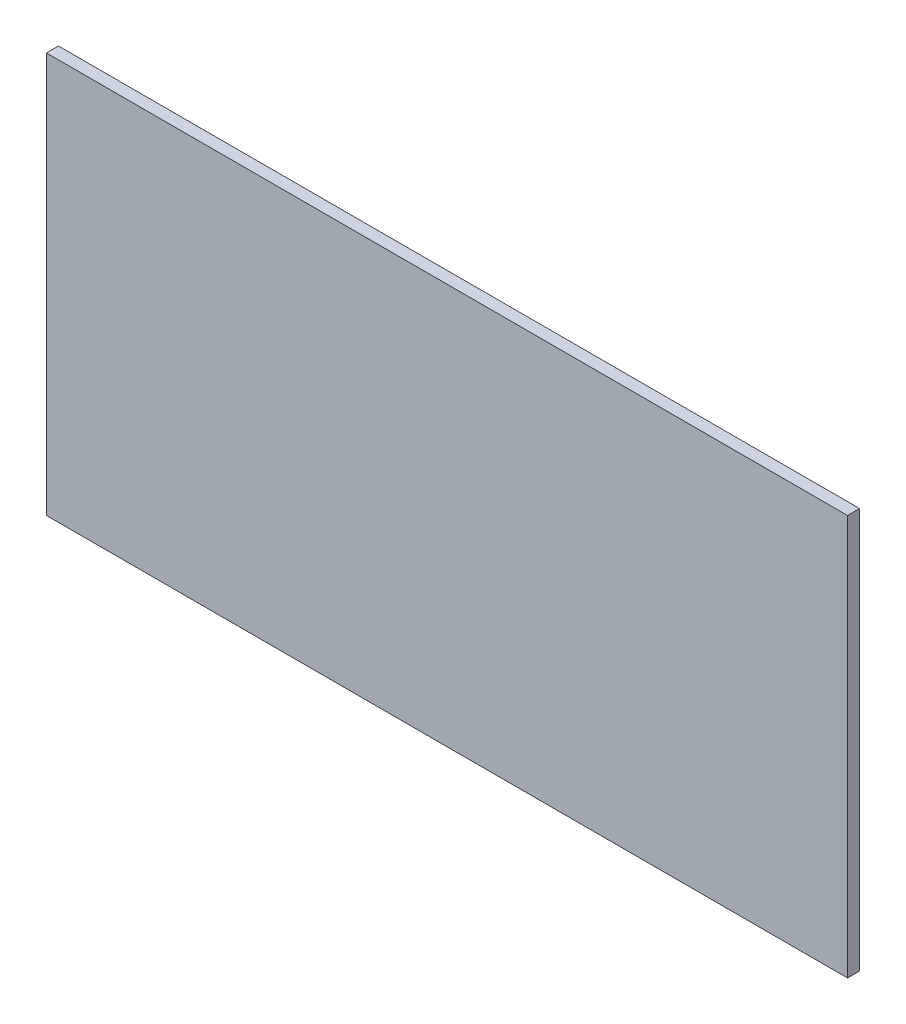
ISO-10303-21;
HEADER;
FILE_DESCRIPTION(('STEP AP214'),'2;1');
FILE_NAME('part.step','',(''),(''),'','','');
FILE_SCHEMA(('AUTOMOTIVE_DESIGN { 1 0 10303 214 1 1 1 1 }'));
ENDSEC;
DATA;
#1=APPLICATION_CONTEXT('core data for automotive mechanical design processes');
#2=APPLICATION_PROTOCOL_DEFINITION('international standard','automotive_design',2000,#1);
#3=PRODUCT_CONTEXT('',#1,'mechanical');
#4=PRODUCT('Part','Part','',(#3));
#5=PRODUCT_RELATED_PRODUCT_CATEGORY('part','',(#4));
#6=PRODUCT_DEFINITION_FORMATION('','',#4);
#7=PRODUCT_DEFINITION_CONTEXT('part definition',#1,'design');
#8=PRODUCT_DEFINITION('design','',#6,#7);
#9=PRODUCT_DEFINITION_SHAPE('','',#8);
#10=(LENGTH_UNIT() NAMED_UNIT(*) SI_UNIT(.MILLI.,.METRE.));
#11=(NAMED_UNIT(*) PLANE_ANGLE_UNIT() SI_UNIT($,.RADIAN.));
#12=(NAMED_UNIT(*) SI_UNIT($,.STERADIAN.) SOLID_ANGLE_UNIT());
#13=UNCERTAINTY_MEASURE_WITH_UNIT(LENGTH_MEASURE(1.E-05),#10,'distance_accuracy_value','');
#14=(GEOMETRIC_REPRESENTATION_CONTEXT(3) GLOBAL_UNCERTAINTY_ASSIGNED_CONTEXT((#13)) GLOBAL_UNIT_ASSIGNED_CONTEXT((#10,
#11,#12)) REPRESENTATION_CONTEXT('',''));
#15=CARTESIAN_POINT('',(0.,0.,0.));
#16=DIRECTION('',(0.,0.,1.));
#17=DIRECTION('',(1.,0.,0.));
#18=AXIS2_PLACEMENT_3D('',#15,#16,#17);
#19=CARTESIAN_POINT('',(100.,-50.,3.));
#20=DIRECTION('',(-1.,0.,0.));
#21=DIRECTION('',(0.,0.,1.));
#22=AXIS2_PLACEMENT_3D('',#19,#20,#21);
#23=PLANE('',#22);
#24=DIRECTION('',(0.,1.,0.));
#25=VECTOR('',#24,1.);
#26=CARTESIAN_POINT('',(100.,-50.,0.));
#27=LINE('',#26,#25);
#28=CARTESIAN_POINT('',(100.,-50.,0.));
#29=VERTEX_POINT('',#28);
#30=CARTESIAN_POINT('',(100.,50.,0.));
#31=VERTEX_POINT('',#30);
#32=EDGE_CURVE('E97',#29,#31,#27,.T.);
#33=ORIENTED_EDGE('',*,*,#32,.T.);
#34=DIRECTION('',(0.,0.,-1.));
#35=VECTOR('',#34,1.);
#36=CARTESIAN_POINT('',(100.,50.,3.));
#37=LINE('',#36,#35);
#38=CARTESIAN_POINT('',(100.,50.,3.));
#39=VERTEX_POINT('',#38);
#40=EDGE_CURVE('E11',#39,#31,#37,.T.);
#41=ORIENTED_EDGE('',*,*,#40,.F.);
#42=DIRECTION('',(0.,1.,0.));
#43=VECTOR('',#42,1.);
#44=CARTESIAN_POINT('',(100.,-50.,3.));
#45=LINE('',#44,#43);
#46=CARTESIAN_POINT('',(100.,-50.,3.));
#47=VERTEX_POINT('',#46);
#48=EDGE_CURVE('E85',#47,#39,#45,.T.);
#49=ORIENTED_EDGE('',*,*,#48,.F.);
#50=DIRECTION('',(0.,0.,-1.));
#51=VECTOR('',#50,1.);
#52=CARTESIAN_POINT('',(100.,-50.,3.));
#53=LINE('',#52,#51);
#54=EDGE_CURVE('E93',#47,#29,#53,.T.);
#55=ORIENTED_EDGE('',*,*,#54,.T.);
#56=EDGE_LOOP('',(#33,#41,#49,#55));
#57=FACE_BOUND('',#56,.T.);
#58=ADVANCED_FACE('F34',(#57),#23,.F.);
#59=CARTESIAN_POINT('',(-100.,50.,3.));
#60=DIRECTION('',(0.,-1.,0.));
#61=DIRECTION('',(0.,0.,-1.));
#62=AXIS2_PLACEMENT_3D('',#59,#60,#61);
#63=PLANE('',#62);
#64=DIRECTION('',(-1.,0.,0.));
#65=VECTOR('',#64,1.);
#66=CARTESIAN_POINT('',(-100.,50.,0.));
#67=LINE('',#66,#65);
#68=CARTESIAN_POINT('',(-100.,50.,0.));
#69=VERTEX_POINT('',#68);
#70=EDGE_CURVE('E89',#31,#69,#67,.T.);
#71=ORIENTED_EDGE('',*,*,#70,.T.);
#72=DIRECTION('',(0.,0.,-1.));
#73=VECTOR('',#72,1.);
#74=CARTESIAN_POINT('',(-100.,50.,3.));
#75=LINE('',#74,#73);
#76=CARTESIAN_POINT('',(-100.,50.,3.));
#77=VERTEX_POINT('',#76);
#78=EDGE_CURVE('E42',#77,#69,#75,.T.);
#79=ORIENTED_EDGE('',*,*,#78,.F.);
#80=DIRECTION('',(-1.,0.,0.));
#81=VECTOR('',#80,1.);
#82=CARTESIAN_POINT('',(-100.,50.,3.));
#83=LINE('',#82,#81);
#84=EDGE_CURVE('E80',#39,#77,#83,.T.);
#85=ORIENTED_EDGE('',*,*,#84,.F.);
#86=ORIENTED_EDGE('',*,*,#40,.T.);
#87=EDGE_LOOP('',(#71,#79,#85,#86));
#88=FACE_BOUND('',#87,.T.);
#89=ADVANCED_FACE('F88',(#88),#63,.F.);
#90=CARTESIAN_POINT('',(-100.,-50.,3.));
#91=DIRECTION('',(1.,0.,0.));
#92=DIRECTION('',(0.,0.,-1.));
#93=AXIS2_PLACEMENT_3D('',#90,#91,#92);
#94=PLANE('',#93);
#95=DIRECTION('',(0.,-1.,0.));
#96=VECTOR('',#95,1.);
#97=CARTESIAN_POINT('',(-100.,-50.,0.));
#98=LINE('',#97,#96);
#99=CARTESIAN_POINT('',(-100.,-50.,0.));
#100=VERTEX_POINT('',#99);
#101=EDGE_CURVE('E67',#69,#100,#98,.T.);
#102=ORIENTED_EDGE('',*,*,#101,.T.);
#103=DIRECTION('',(0.,0.,-1.));
#104=VECTOR('',#103,1.);
#105=CARTESIAN_POINT('',(-100.,-50.,3.));
#106=LINE('',#105,#104);
#107=CARTESIAN_POINT('',(-100.,-50.,3.));
#108=VERTEX_POINT('',#107);
#109=EDGE_CURVE('E90',#108,#100,#106,.T.);
#110=ORIENTED_EDGE('',*,*,#109,.F.);
#111=DIRECTION('',(0.,-1.,0.));
#112=VECTOR('',#111,1.);
#113=CARTESIAN_POINT('',(-100.,-50.,3.));
#114=LINE('',#113,#112);
#115=EDGE_CURVE('E83',#77,#108,#114,.T.);
#116=ORIENTED_EDGE('',*,*,#115,.F.);
#117=ORIENTED_EDGE('',*,*,#78,.T.);
#118=EDGE_LOOP('',(#102,#110,#116,#117));
#119=FACE_BOUND('',#118,.T.);
#120=ADVANCED_FACE('F91',(#119),#94,.F.);
#121=CARTESIAN_POINT('',(-100.,-50.,3.));
#122=DIRECTION('',(0.,1.,0.));
#123=DIRECTION('',(0.,0.,1.));
#124=AXIS2_PLACEMENT_3D('',#121,#122,#123);
#125=PLANE('',#124);
#126=DIRECTION('',(1.,0.,0.));
#127=VECTOR('',#126,1.);
#128=CARTESIAN_POINT('',(-100.,-50.,0.));
#129=LINE('',#128,#127);
#130=EDGE_CURVE('E73',#100,#29,#129,.T.);
#131=ORIENTED_EDGE('',*,*,#130,.T.);
#132=ORIENTED_EDGE('',*,*,#54,.F.);
#133=DIRECTION('',(1.,0.,0.));
#134=VECTOR('',#133,1.);
#135=CARTESIAN_POINT('',(-100.,-50.,3.));
#136=LINE('',#135,#134);
#137=EDGE_CURVE('E50',#108,#47,#136,.T.);
#138=ORIENTED_EDGE('',*,*,#137,.F.);
#139=ORIENTED_EDGE('',*,*,#109,.T.);
#140=EDGE_LOOP('',(#131,#132,#138,#139));
#141=FACE_BOUND('',#140,.T.);
#142=ADVANCED_FACE('F104',(#141),#125,.F.);
#143=CARTESIAN_POINT('',(0.,0.,3.));
#144=DIRECTION('',(0.,0.,-1.));
#145=DIRECTION('',(-1.,0.,0.));
#146=AXIS2_PLACEMENT_3D('',#143,#144,#145);
#147=PLANE('',#146);
#148=ORIENTED_EDGE('',*,*,#48,.T.);
#149=ORIENTED_EDGE('',*,*,#84,.T.);
#150=ORIENTED_EDGE('',*,*,#115,.T.);
#151=ORIENTED_EDGE('',*,*,#137,.T.);
#152=EDGE_LOOP('',(#148,#149,#150,#151));
#153=FACE_BOUND('',#152,.T.);
#154=ADVANCED_FACE('F81',(#153),#147,.F.);
#155=CARTESIAN_POINT('',(0.,0.,0.));
#156=DIRECTION('',(0.,0.,-1.));
#157=DIRECTION('',(-1.,0.,0.));
#158=AXIS2_PLACEMENT_3D('',#155,#156,#157);
#159=PLANE('',#158);
#160=ORIENTED_EDGE('',*,*,#32,.F.);
#161=ORIENTED_EDGE('',*,*,#130,.F.);
#162=ORIENTED_EDGE('',*,*,#101,.F.);
#163=ORIENTED_EDGE('',*,*,#70,.F.);
#164=EDGE_LOOP('',(#160,#161,#162,#163));
#165=FACE_BOUND('',#164,.T.);
#166=ADVANCED_FACE('F107',(#165),#159,.T.);
#167=CLOSED_SHELL('',(#58,#89,#120,#142,#154,#166));
#168=MANIFOLD_SOLID_BREP('B2',#167);
#169=ADVANCED_BREP_SHAPE_REPRESENTATION('',(#18,#168),#14);
#170=SHAPE_DEFINITION_REPRESENTATION(#9,#169);
ENDSEC;
END-ISO-10303-21;
